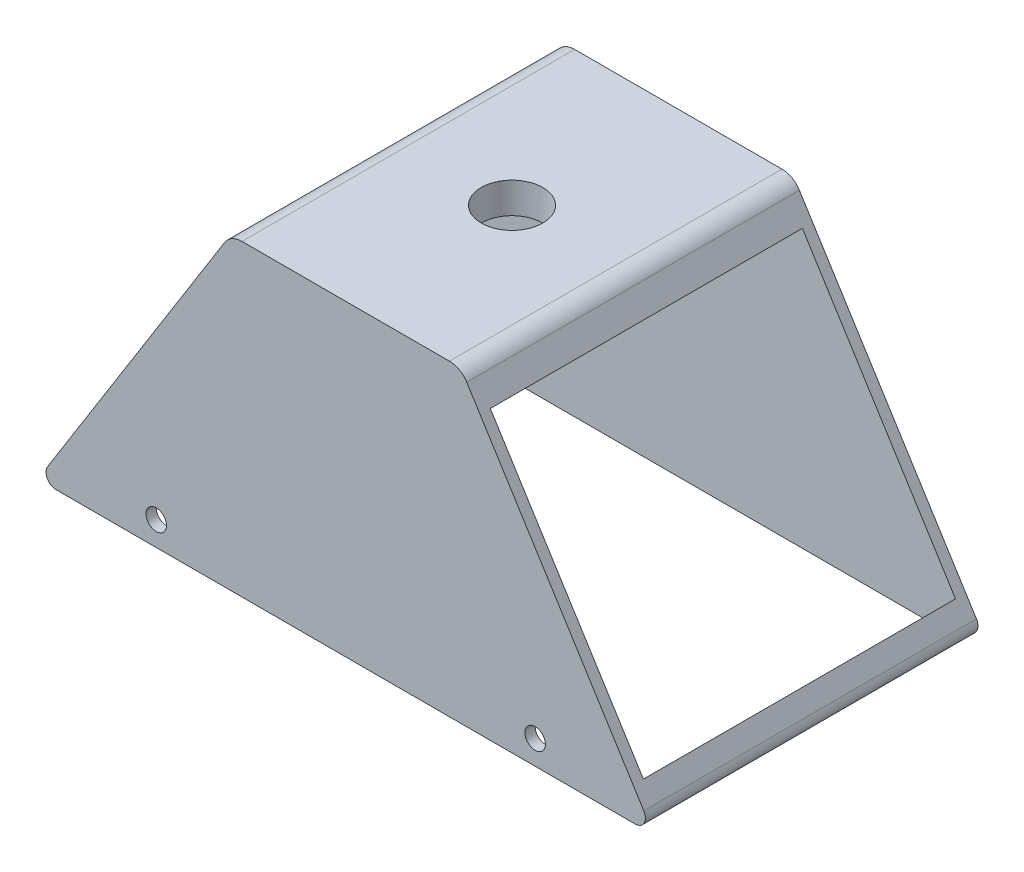
ISO-10303-21;
HEADER;
FILE_DESCRIPTION(('STEP AP214'),'2;1');
FILE_NAME('part.step','',(''),(''),'','','');
FILE_SCHEMA(('AUTOMOTIVE_DESIGN { 1 0 10303 214 1 1 1 1 }'));
ENDSEC;
DATA;
#1=APPLICATION_CONTEXT('core data for automotive mechanical design processes');
#2=APPLICATION_PROTOCOL_DEFINITION('international standard','automotive_design',2000,#1);
#3=PRODUCT_CONTEXT('',#1,'mechanical');
#4=PRODUCT('Part','Part','',(#3));
#5=PRODUCT_RELATED_PRODUCT_CATEGORY('part','',(#4));
#6=PRODUCT_DEFINITION_FORMATION('','',#4);
#7=PRODUCT_DEFINITION_CONTEXT('part definition',#1,'design');
#8=PRODUCT_DEFINITION('design','',#6,#7);
#9=PRODUCT_DEFINITION_SHAPE('','',#8);
#10=(LENGTH_UNIT() NAMED_UNIT(*) SI_UNIT(.MILLI.,.METRE.));
#11=(NAMED_UNIT(*) PLANE_ANGLE_UNIT() SI_UNIT($,.RADIAN.));
#12=(NAMED_UNIT(*) SI_UNIT($,.STERADIAN.) SOLID_ANGLE_UNIT());
#13=UNCERTAINTY_MEASURE_WITH_UNIT(LENGTH_MEASURE(1.E-05),#10,'distance_accuracy_value','');
#14=(GEOMETRIC_REPRESENTATION_CONTEXT(3) GLOBAL_UNCERTAINTY_ASSIGNED_CONTEXT((#13)) GLOBAL_UNIT_ASSIGNED_CONTEXT((#10,
#11,#12)) REPRESENTATION_CONTEXT('',''));
#15=CARTESIAN_POINT('',(0.,0.,0.));
#16=DIRECTION('',(0.,0.,1.));
#17=DIRECTION('',(1.,0.,0.));
#18=AXIS2_PLACEMENT_3D('',#15,#16,#17);
#19=CARTESIAN_POINT('',(-46.0372414198051,83.9135597117547,162.));
#20=DIRECTION('',(0.847457627118644,-0.53086304282596,0.));
#21=DIRECTION('',(0.53086304282596,0.847457627118644,0.));
#22=AXIS2_PLACEMENT_3D('',#19,#20,#21);
#23=PLANE('',#22);
#24=DIRECTION('',(-0.53086304282596,-0.847457627118644,0.));
#25=VECTOR('',#24,1.);
#26=CARTESIAN_POINT('',(-46.0372414198051,83.9135597117547,157.));
#27=LINE('',#26,#25);
#28=CARTESIAN_POINT('',(-55.4335172778245,68.9135597117547,157.));
#29=VERTEX_POINT('',#28);
#30=CARTESIAN_POINT('',(-130.,-50.1226688678928,157.));
#31=VERTEX_POINT('',#30);
#32=EDGE_CURVE('E199',#29,#31,#27,.T.);
#33=ORIENTED_EDGE('',*,*,#32,.T.);
#34=DIRECTION('',(0.,0.,-1.));
#35=VECTOR('',#34,1.);
#36=CARTESIAN_POINT('',(-130.,-50.1226688678928,162.));
#37=LINE('',#36,#35);
#38=CARTESIAN_POINT('',(-130.,-50.1226688678928,5.));
#39=VERTEX_POINT('',#38);
#40=EDGE_CURVE('E202',#31,#39,#37,.T.);
#41=ORIENTED_EDGE('',*,*,#40,.T.);
#42=DIRECTION('',(0.53086304282596,0.847457627118644,0.));
#43=VECTOR('',#42,1.);
#44=CARTESIAN_POINT('',(-46.0372414198051,83.9135597117547,5.));
#45=LINE('',#44,#43);
#46=CARTESIAN_POINT('',(-55.4335172778245,68.9135597117547,5.));
#47=VERTEX_POINT('',#46);
#48=EDGE_CURVE('E196',#39,#47,#45,.T.);
#49=ORIENTED_EDGE('',*,*,#48,.T.);
#50=DIRECTION('',(0.,0.,-1.));
#51=VECTOR('',#50,1.);
#52=CARTESIAN_POINT('',(-55.4335172778245,68.9135597117547,162.));
#53=LINE('',#52,#51);
#54=EDGE_CURVE('E194',#29,#47,#53,.T.);
#55=ORIENTED_EDGE('',*,*,#54,.F.);
#56=EDGE_LOOP('',(#33,#41,#49,#55));
#57=FACE_BOUND('',#56,.T.);
#58=DIRECTION('',(-0.53086304282596,-0.847457627118644,0.));
#59=VECTOR('',#58,1.);
#60=CARTESIAN_POINT('',(-46.0372414198051,83.9135597117547,0.));
#61=LINE('',#60,#59);
#62=CARTESIAN_POINT('',(-48.9760015963378,79.2221901400143,0.));
#63=VERTEX_POINT('',#62);
#64=CARTESIAN_POINT('',(-135.20519618292,-58.4321250741155,0.));
#65=VERTEX_POINT('',#64);
#66=EDGE_CURVE('E208',#63,#65,#61,.T.);
#67=ORIENTED_EDGE('',*,*,#66,.T.);
#68=DIRECTION('',(0.,0.,-1.));
#69=VECTOR('',#68,1.);
#70=CARTESIAN_POINT('',(-135.20519618292,-58.4321250741155,162.));
#71=LINE('',#70,#69);
#72=CARTESIAN_POINT('',(-135.20519618292,-58.4321250741155,162.));
#73=VERTEX_POINT('',#72);
#74=EDGE_CURVE('E13',#65,#73,#71,.F.);
#75=ORIENTED_EDGE('',*,*,#74,.T.);
#76=DIRECTION('',(-0.53086304282596,-0.847457627118644,0.));
#77=VECTOR('',#76,1.);
#78=CARTESIAN_POINT('',(-46.0372414198051,83.9135597117547,162.));
#79=LINE('',#78,#77);
#80=CARTESIAN_POINT('',(-48.9760015963378,79.2221901400143,162.));
#81=VERTEX_POINT('',#80);
#82=EDGE_CURVE('E209',#81,#73,#79,.T.);
#83=ORIENTED_EDGE('',*,*,#82,.F.);
#84=DIRECTION('',(0.,0.,-1.));
#85=VECTOR('',#84,1.);
#86=CARTESIAN_POINT('',(-48.9760015963378,79.2221901400143,162.));
#87=LINE('',#86,#85);
#88=EDGE_CURVE('E232',#81,#63,#87,.T.);
#89=ORIENTED_EDGE('',*,*,#88,.T.);
#90=EDGE_LOOP('',(#67,#75,#83,#89));
#91=FACE_BOUND('',#90,.T.);
#92=ADVANCED_FACE('F47',(#57,#91),#23,.F.);
#93=CARTESIAN_POINT('',(10.,-66.0864402882453,162.));
#94=DIRECTION('',(0.,1.,0.));
#95=DIRECTION('',(0.,0.,1.));
#96=AXIS2_PLACEMENT_3D('',#93,#94,#95);
#97=PLANE('',#96);
#98=DIRECTION('',(1.,0.,0.));
#99=VECTOR('',#98,1.);
#100=CARTESIAN_POINT('',(-130.,-66.0864402882453,5.));
#101=LINE('',#100,#99);
#102=CARTESIAN_POINT('',(-130.,-66.0864402882453,5.));
#103=VERTEX_POINT('',#102);
#104=CARTESIAN_POINT('',(150.,-66.0864402882453,5.));
#105=VERTEX_POINT('',#104);
#106=EDGE_CURVE('E169',#103,#105,#101,.T.);
#107=ORIENTED_EDGE('',*,*,#106,.F.);
#108=DIRECTION('',(0.,0.,-1.));
#109=VECTOR('',#108,1.);
#110=CARTESIAN_POINT('',(-130.,-66.0864402882453,157.));
#111=LINE('',#110,#109);
#112=CARTESIAN_POINT('',(-130.,-66.0864402882453,157.));
#113=VERTEX_POINT('',#112);
#114=EDGE_CURVE('E174',#113,#103,#111,.T.);
#115=ORIENTED_EDGE('',*,*,#114,.F.);
#116=DIRECTION('',(-1.,0.,0.));
#117=VECTOR('',#116,1.);
#118=CARTESIAN_POINT('',(-130.,-66.0864402882453,157.));
#119=LINE('',#118,#117);
#120=CARTESIAN_POINT('',(150.,-66.0864402882453,157.));
#121=VERTEX_POINT('',#120);
#122=EDGE_CURVE('E178',#121,#113,#119,.T.);
#123=ORIENTED_EDGE('',*,*,#122,.F.);
#124=DIRECTION('',(0.,0.,1.));
#125=VECTOR('',#124,1.);
#126=CARTESIAN_POINT('',(150.,-66.0864402882453,157.));
#127=LINE('',#126,#125);
#128=EDGE_CURVE('E157',#105,#121,#127,.T.);
#129=ORIENTED_EDGE('',*,*,#128,.F.);
#130=EDGE_LOOP('',(#107,#115,#123,#129));
#131=FACE_BOUND('',#130,.T.);
#132=DIRECTION('',(1.,0.,0.));
#133=VECTOR('',#132,1.);
#134=CARTESIAN_POINT('',(10.,-66.0864402882453,0.));
#135=LINE('',#134,#133);
#136=CARTESIAN_POINT('',(-130.967908047327,-66.0864402882453,0.));
#137=VERTEX_POINT('',#136);
#138=CARTESIAN_POINT('',(150.967908047327,-66.0864402882453,0.));
#139=VERTEX_POINT('',#138);
#140=EDGE_CURVE('E221',#137,#139,#135,.T.);
#141=ORIENTED_EDGE('',*,*,#140,.T.);
#142=DIRECTION('',(0.,0.,-1.));
#143=VECTOR('',#142,1.);
#144=CARTESIAN_POINT('',(150.967908047327,-66.0864402882453,162.));
#145=LINE('',#144,#143);
#146=CARTESIAN_POINT('',(150.967908047327,-66.0864402882453,162.));
#147=VERTEX_POINT('',#146);
#148=EDGE_CURVE('E70',#139,#147,#145,.F.);
#149=ORIENTED_EDGE('',*,*,#148,.T.);
#150=DIRECTION('',(1.,0.,0.));
#151=VECTOR('',#150,1.);
#152=CARTESIAN_POINT('',(10.,-66.0864402882453,162.));
#153=LINE('',#152,#151);
#154=CARTESIAN_POINT('',(-130.967908047327,-66.0864402882453,162.));
#155=VERTEX_POINT('',#154);
#156=EDGE_CURVE('E211',#155,#147,#153,.T.);
#157=ORIENTED_EDGE('',*,*,#156,.F.);
#158=DIRECTION('',(0.,0.,-1.));
#159=VECTOR('',#158,1.);
#160=CARTESIAN_POINT('',(-130.967908047327,-66.0864402882453,162.));
#161=LINE('',#160,#159);
#162=EDGE_CURVE('E259',#155,#137,#161,.T.);
#163=ORIENTED_EDGE('',*,*,#162,.T.);
#164=EDGE_LOOP('',(#141,#149,#157,#163));
#165=FACE_BOUND('',#164,.T.);
#166=ADVANCED_FACE('F176',(#131,#165),#97,.F.);
#167=CARTESIAN_POINT('',(66.0372414198051,83.9135597117547,162.));
#168=DIRECTION('',(-0.847457627118644,-0.53086304282596,0.));
#169=DIRECTION('',(0.53086304282596,-0.847457627118644,0.));
#170=AXIS2_PLACEMENT_3D('',#167,#168,#169);
#171=PLANE('',#170);
#172=DIRECTION('',(0.,0.,1.));
#173=VECTOR('',#172,1.);
#174=CARTESIAN_POINT('',(150.,-50.1226688678928,162.));
#175=LINE('',#174,#173);
#176=CARTESIAN_POINT('',(150.,-50.1226688678928,5.));
#177=VERTEX_POINT('',#176);
#178=CARTESIAN_POINT('',(150.,-50.1226688678928,157.));
#179=VERTEX_POINT('',#178);
#180=EDGE_CURVE('E160',#177,#179,#175,.T.);
#181=ORIENTED_EDGE('',*,*,#180,.T.);
#182=DIRECTION('',(-0.53086304282596,0.847457627118644,0.));
#183=VECTOR('',#182,1.);
#184=CARTESIAN_POINT('',(66.0372414198051,83.9135597117547,157.));
#185=LINE('',#184,#183);
#186=CARTESIAN_POINT('',(75.4335172778246,68.9135597117547,157.));
#187=VERTEX_POINT('',#186);
#188=EDGE_CURVE('E229',#179,#187,#185,.T.);
#189=ORIENTED_EDGE('',*,*,#188,.T.);
#190=DIRECTION('',(0.,0.,1.));
#191=VECTOR('',#190,1.);
#192=CARTESIAN_POINT('',(75.4335172778246,68.9135597117547,162.));
#193=LINE('',#192,#191);
#194=CARTESIAN_POINT('',(75.4335172778246,68.9135597117547,5.));
#195=VERTEX_POINT('',#194);
#196=EDGE_CURVE('E192',#195,#187,#193,.T.);
#197=ORIENTED_EDGE('',*,*,#196,.F.);
#198=DIRECTION('',(0.53086304282596,-0.847457627118644,0.));
#199=VECTOR('',#198,1.);
#200=CARTESIAN_POINT('',(66.0372414198051,83.9135597117547,5.));
#201=LINE('',#200,#199);
#202=EDGE_CURVE('E219',#195,#177,#201,.T.);
#203=ORIENTED_EDGE('',*,*,#202,.T.);
#204=EDGE_LOOP('',(#181,#189,#197,#203));
#205=FACE_BOUND('',#204,.T.);
#206=DIRECTION('',(-0.53086304282596,0.847457627118644,0.));
#207=VECTOR('',#206,1.);
#208=CARTESIAN_POINT('',(66.0372414198051,83.9135597117547,162.));
#209=LINE('',#208,#207);
#210=CARTESIAN_POINT('',(155.20519618292,-58.4321250741155,162.));
#211=VERTEX_POINT('',#210);
#212=CARTESIAN_POINT('',(68.9760015963379,79.2221901400143,162.));
#213=VERTEX_POINT('',#212);
#214=EDGE_CURVE('E214',#211,#213,#209,.T.);
#215=ORIENTED_EDGE('',*,*,#214,.F.);
#216=DIRECTION('',(0.,0.,-1.));
#217=VECTOR('',#216,1.);
#218=CARTESIAN_POINT('',(155.20519618292,-58.4321250741155,162.));
#219=LINE('',#218,#217);
#220=CARTESIAN_POINT('',(155.20519618292,-58.4321250741155,0.));
#221=VERTEX_POINT('',#220);
#222=EDGE_CURVE('E252',#211,#221,#219,.T.);
#223=ORIENTED_EDGE('',*,*,#222,.T.);
#224=DIRECTION('',(-0.53086304282596,0.847457627118644,0.));
#225=VECTOR('',#224,1.);
#226=CARTESIAN_POINT('',(66.0372414198051,83.9135597117547,0.));
#227=LINE('',#226,#225);
#228=CARTESIAN_POINT('',(68.9760015963379,79.2221901400143,0.));
#229=VERTEX_POINT('',#228);
#230=EDGE_CURVE('E223',#221,#229,#227,.T.);
#231=ORIENTED_EDGE('',*,*,#230,.T.);
#232=DIRECTION('',(0.,0.,-1.));
#233=VECTOR('',#232,1.);
#234=CARTESIAN_POINT('',(68.9760015963379,79.2221901400143,162.));
#235=LINE('',#234,#233);
#236=EDGE_CURVE('E249',#229,#213,#235,.F.);
#237=ORIENTED_EDGE('',*,*,#236,.T.);
#238=EDGE_LOOP('',(#215,#223,#231,#237));
#239=FACE_BOUND('',#238,.T.);
#240=ADVANCED_FACE('F293',(#205,#239),#171,.F.);
#241=CARTESIAN_POINT('',(-46.0372414198051,83.9135597117547,162.));
#242=DIRECTION('',(0.,-1.,0.));
#243=DIRECTION('',(0.,0.,-1.));
#244=AXIS2_PLACEMENT_3D('',#241,#242,#243);
#245=PLANE('',#244);
#246=CARTESIAN_POINT('',(10.,83.9135597117547,81.));
#247=DIRECTION('',(0.,1.,0.));
#248=DIRECTION('',(-1.,0.,0.));
#249=AXIS2_PLACEMENT_3D('',#246,#247,#248);
#250=CIRCLE('',#249,15.);
#251=CARTESIAN_POINT('',(-5.,83.9135597117547,81.));
#252=VERTEX_POINT('',#251);
#253=EDGE_CURVE('E205',#252,#252,#250,.T.);
#254=ORIENTED_EDGE('',*,*,#253,.F.);
#255=EDGE_LOOP('',(#254));
#256=FACE_BOUND('',#255,.T.);
#257=DIRECTION('',(-1.,0.,0.));
#258=VECTOR('',#257,1.);
#259=CARTESIAN_POINT('',(-46.0372414198051,83.9135597117547,0.));
#260=LINE('',#259,#258);
#261=CARTESIAN_POINT('',(60.5014253251514,83.9135597117547,0.));
#262=VERTEX_POINT('',#261);
#263=CARTESIAN_POINT('',(-40.5014253251514,83.9135597117547,0.));
#264=VERTEX_POINT('',#263);
#265=EDGE_CURVE('E212',#262,#264,#260,.T.);
#266=ORIENTED_EDGE('',*,*,#265,.T.);
#267=DIRECTION('',(0.,0.,-1.));
#268=VECTOR('',#267,1.);
#269=CARTESIAN_POINT('',(-40.5014253251514,83.9135597117547,162.));
#270=LINE('',#269,#268);
#271=CARTESIAN_POINT('',(-40.5014253251514,83.9135597117547,162.));
#272=VERTEX_POINT('',#271);
#273=EDGE_CURVE('E243',#264,#272,#270,.F.);
#274=ORIENTED_EDGE('',*,*,#273,.T.);
#275=DIRECTION('',(-1.,0.,0.));
#276=VECTOR('',#275,1.);
#277=CARTESIAN_POINT('',(-46.0372414198051,83.9135597117547,162.));
#278=LINE('',#277,#276);
#279=CARTESIAN_POINT('',(60.5014253251514,83.9135597117547,162.));
#280=VERTEX_POINT('',#279);
#281=EDGE_CURVE('E216',#280,#272,#278,.T.);
#282=ORIENTED_EDGE('',*,*,#281,.F.);
#283=DIRECTION('',(0.,0.,-1.));
#284=VECTOR('',#283,1.);
#285=CARTESIAN_POINT('',(60.5014253251514,83.9135597117547,162.));
#286=LINE('',#285,#284);
#287=EDGE_CURVE('E240',#280,#262,#286,.T.);
#288=ORIENTED_EDGE('',*,*,#287,.T.);
#289=EDGE_LOOP('',(#266,#274,#282,#288));
#290=FACE_BOUND('',#289,.T.);
#291=ADVANCED_FACE('F296',(#256,#290),#245,.F.);
#292=CARTESIAN_POINT('',(0.,0.,162.));
#293=DIRECTION('',(0.,0.,1.));
#294=DIRECTION('',(1.,0.,0.));
#295=AXIS2_PLACEMENT_3D('',#292,#293,#294);
#296=PLANE('',#295);
#297=CARTESIAN_POINT('',(-82.275314,-54.3506202882453,162.));
#298=DIRECTION('',(0.,0.,1.));
#299=DIRECTION('',(-1.,0.,0.));
#300=AXIS2_PLACEMENT_3D('',#297,#298,#299);
#301=CIRCLE('',#300,5.00000000000001);
#302=CARTESIAN_POINT('',(-87.275314,-54.3506202882453,162.));
#303=VERTEX_POINT('',#302);
#304=EDGE_CURVE('E275',#303,#303,#301,.T.);
#305=ORIENTED_EDGE('',*,*,#304,.F.);
#306=EDGE_LOOP('',(#305));
#307=FACE_BOUND('',#306,.T.);
#308=CARTESIAN_POINT('',(102.275314,-54.3506202882453,162.));
#309=DIRECTION('',(0.,0.,1.));
#310=DIRECTION('',(1.,0.,0.));
#311=AXIS2_PLACEMENT_3D('',#308,#309,#310);
#312=CIRCLE('',#311,5.00000000000001);
#313=CARTESIAN_POINT('',(107.275314,-54.3506202882453,162.));
#314=VERTEX_POINT('',#313);
#315=EDGE_CURVE('E267',#314,#314,#312,.T.);
#316=ORIENTED_EDGE('',*,*,#315,.F.);
#317=EDGE_LOOP('',(#316));
#318=FACE_BOUND('',#317,.T.);
#319=ORIENTED_EDGE('',*,*,#156,.T.);
#320=CARTESIAN_POINT('',(150.967908047327,-61.0864402882453,162.));
#321=DIRECTION('',(0.,0.,1.));
#322=DIRECTION('',(1.,0.,0.));
#323=AXIS2_PLACEMENT_3D('',#320,#321,#322);
#324=CIRCLE('',#323,5.);
#325=EDGE_CURVE('E56',#147,#211,#324,.T.);
#326=ORIENTED_EDGE('',*,*,#325,.T.);
#327=ORIENTED_EDGE('',*,*,#214,.T.);
#328=CARTESIAN_POINT('',(60.5014253251514,73.9135597117547,162.));
#329=DIRECTION('',(0.,0.,1.));
#330=DIRECTION('',(1.,0.,0.));
#331=AXIS2_PLACEMENT_3D('',#328,#329,#330);
#332=CIRCLE('',#331,10.);
#333=EDGE_CURVE('E245',#213,#280,#332,.T.);
#334=ORIENTED_EDGE('',*,*,#333,.T.);
#335=ORIENTED_EDGE('',*,*,#281,.T.);
#336=CARTESIAN_POINT('',(-40.5014253251514,73.9135597117547,162.));
#337=DIRECTION('',(0.,0.,1.));
#338=DIRECTION('',(1.,0.,0.));
#339=AXIS2_PLACEMENT_3D('',#336,#337,#338);
#340=CIRCLE('',#339,10.);
#341=EDGE_CURVE('E247',#272,#81,#340,.T.);
#342=ORIENTED_EDGE('',*,*,#341,.T.);
#343=ORIENTED_EDGE('',*,*,#82,.T.);
#344=CARTESIAN_POINT('',(-130.967908047327,-61.0864402882453,162.));
#345=DIRECTION('',(0.,0.,1.));
#346=DIRECTION('',(1.,0.,0.));
#347=AXIS2_PLACEMENT_3D('',#344,#345,#346);
#348=CIRCLE('',#347,5.);
#349=EDGE_CURVE('E263',#73,#155,#348,.T.);
#350=ORIENTED_EDGE('',*,*,#349,.T.);
#351=EDGE_LOOP('',(#319,#326,#327,#334,#335,#342,#343,#350));
#352=FACE_BOUND('',#351,.T.);
#353=ADVANCED_FACE('F325',(#307,#318,#352),#296,.T.);
#354=CARTESIAN_POINT('',(0.,0.,0.));
#355=DIRECTION('',(0.,0.,1.));
#356=DIRECTION('',(1.,0.,0.));
#357=AXIS2_PLACEMENT_3D('',#354,#355,#356);
#358=PLANE('',#357);
#359=ORIENTED_EDGE('',*,*,#230,.F.);
#360=CARTESIAN_POINT('',(150.967908047327,-61.0864402882453,0.));
#361=DIRECTION('',(0.,0.,1.));
#362=DIRECTION('',(1.,0.,0.));
#363=AXIS2_PLACEMENT_3D('',#360,#361,#362);
#364=CIRCLE('',#363,5.);
#365=EDGE_CURVE('E257',#221,#139,#364,.F.);
#366=ORIENTED_EDGE('',*,*,#365,.T.);
#367=ORIENTED_EDGE('',*,*,#140,.F.);
#368=CARTESIAN_POINT('',(-130.967908047327,-61.0864402882453,0.));
#369=DIRECTION('',(0.,0.,1.));
#370=DIRECTION('',(1.,0.,0.));
#371=AXIS2_PLACEMENT_3D('',#368,#369,#370);
#372=CIRCLE('',#371,5.);
#373=EDGE_CURVE('E255',#137,#65,#372,.F.);
#374=ORIENTED_EDGE('',*,*,#373,.T.);
#375=ORIENTED_EDGE('',*,*,#66,.F.);
#376=CARTESIAN_POINT('',(-40.5014253251514,73.9135597117547,0.));
#377=DIRECTION('',(0.,0.,1.));
#378=DIRECTION('',(1.,0.,0.));
#379=AXIS2_PLACEMENT_3D('',#376,#377,#378);
#380=CIRCLE('',#379,10.);
#381=EDGE_CURVE('E238',#63,#264,#380,.F.);
#382=ORIENTED_EDGE('',*,*,#381,.T.);
#383=ORIENTED_EDGE('',*,*,#265,.F.);
#384=CARTESIAN_POINT('',(60.5014253251514,73.9135597117547,0.));
#385=DIRECTION('',(0.,0.,1.));
#386=DIRECTION('',(1.,0.,0.));
#387=AXIS2_PLACEMENT_3D('',#384,#385,#386);
#388=CIRCLE('',#387,10.);
#389=EDGE_CURVE('E235',#262,#229,#388,.F.);
#390=ORIENTED_EDGE('',*,*,#389,.T.);
#391=EDGE_LOOP('',(#359,#366,#367,#374,#375,#382,#383,#390));
#392=FACE_BOUND('',#391,.T.);
#393=ADVANCED_FACE('F309',(#392),#358,.F.);
#394=CARTESIAN_POINT('',(10.,68.9135597117547,81.));
#395=DIRECTION('',(0.,1.,0.));
#396=DIRECTION('',(-1.,0.,0.));
#397=AXIS2_PLACEMENT_3D('',#394,#395,#396);
#398=CYLINDRICAL_SURFACE('',#397,15.);
#399=CARTESIAN_POINT('',(10.,68.9135597117547,81.));
#400=DIRECTION('',(0.,-1.,0.));
#401=DIRECTION('',(0.,0.,-1.));
#402=AXIS2_PLACEMENT_3D('',#399,#400,#401);
#403=CIRCLE('',#402,15.);
#404=CARTESIAN_POINT('',(10.,68.9135597117547,66.));
#405=VERTEX_POINT('',#404);
#406=EDGE_CURVE('E186',#405,#405,#403,.F.);
#407=ORIENTED_EDGE('',*,*,#406,.F.);
#408=EDGE_LOOP('',(#407));
#409=FACE_BOUND('',#408,.T.);
#410=ORIENTED_EDGE('',*,*,#253,.T.);
#411=EDGE_LOOP('',(#410));
#412=FACE_BOUND('',#411,.T.);
#413=ADVANCED_FACE('F333',(#409,#412),#398,.F.);
#414=CARTESIAN_POINT('',(-130.,68.9135597117547,157.));
#415=DIRECTION('',(-1.,0.,0.));
#416=DIRECTION('',(0.,0.,1.));
#417=AXIS2_PLACEMENT_3D('',#414,#415,#416);
#418=PLANE('',#417);
#419=DIRECTION('',(0.,-1.,0.));
#420=VECTOR('',#419,1.);
#421=CARTESIAN_POINT('',(-130.,68.9135597117547,157.));
#422=LINE('',#421,#420);
#423=EDGE_CURVE('E184',#31,#113,#422,.T.);
#424=ORIENTED_EDGE('',*,*,#423,.T.);
#425=ORIENTED_EDGE('',*,*,#114,.T.);
#426=DIRECTION('',(0.,-1.,0.));
#427=VECTOR('',#426,1.);
#428=CARTESIAN_POINT('',(-130.,68.9135597117547,5.));
#429=LINE('',#428,#427);
#430=EDGE_CURVE('E165',#39,#103,#429,.T.);
#431=ORIENTED_EDGE('',*,*,#430,.F.);
#432=ORIENTED_EDGE('',*,*,#40,.F.);
#433=EDGE_LOOP('',(#424,#425,#431,#432));
#434=FACE_BOUND('',#433,.T.);
#435=ADVANCED_FACE('F291',(#434),#418,.F.);
#436=CARTESIAN_POINT('',(-130.,68.9135597117547,157.));
#437=DIRECTION('',(0.,0.,1.));
#438=DIRECTION('',(1.,0.,0.));
#439=AXIS2_PLACEMENT_3D('',#436,#437,#438);
#440=PLANE('',#439);
#441=CARTESIAN_POINT('',(-82.275314,-54.3506202882453,157.));
#442=DIRECTION('',(0.,0.,1.));
#443=DIRECTION('',(1.,0.,0.));
#444=AXIS2_PLACEMENT_3D('',#441,#442,#443);
#445=CIRCLE('',#444,5.00000000000001);
#446=CARTESIAN_POINT('',(-77.275314,-54.3506202882453,157.));
#447=VERTEX_POINT('',#446);
#448=EDGE_CURVE('E51',#447,#447,#445,.T.);
#449=ORIENTED_EDGE('',*,*,#448,.T.);
#450=EDGE_LOOP('',(#449));
#451=FACE_BOUND('',#450,.T.);
#452=CARTESIAN_POINT('',(102.275314,-54.3506202882453,157.));
#453=DIRECTION('',(0.,0.,1.));
#454=DIRECTION('',(1.,0.,0.));
#455=AXIS2_PLACEMENT_3D('',#452,#453,#454);
#456=CIRCLE('',#455,5.00000000000001);
#457=CARTESIAN_POINT('',(107.275314,-54.3506202882453,157.));
#458=VERTEX_POINT('',#457);
#459=EDGE_CURVE('E265',#458,#458,#456,.T.);
#460=ORIENTED_EDGE('',*,*,#459,.T.);
#461=EDGE_LOOP('',(#460));
#462=FACE_BOUND('',#461,.T.);
#463=DIRECTION('',(-1.,0.,0.));
#464=VECTOR('',#463,1.);
#465=CARTESIAN_POINT('',(-130.,68.9135597117547,157.));
#466=LINE('',#465,#464);
#467=EDGE_CURVE('E189',#187,#29,#466,.T.);
#468=ORIENTED_EDGE('',*,*,#467,.F.);
#469=ORIENTED_EDGE('',*,*,#188,.F.);
#470=DIRECTION('',(0.,-1.,0.));
#471=VECTOR('',#470,1.);
#472=CARTESIAN_POINT('',(150.,68.9135597117547,157.));
#473=LINE('',#472,#471);
#474=EDGE_CURVE('E164',#179,#121,#473,.T.);
#475=ORIENTED_EDGE('',*,*,#474,.T.);
#476=ORIENTED_EDGE('',*,*,#122,.T.);
#477=ORIENTED_EDGE('',*,*,#423,.F.);
#478=ORIENTED_EDGE('',*,*,#32,.F.);
#479=EDGE_LOOP('',(#468,#469,#475,#476,#477,#478));
#480=FACE_BOUND('',#479,.T.);
#481=ADVANCED_FACE('F288',(#451,#462,#480),#440,.F.);
#482=CARTESIAN_POINT('',(150.,68.9135597117547,157.));
#483=DIRECTION('',(1.,0.,0.));
#484=DIRECTION('',(0.,0.,-1.));
#485=AXIS2_PLACEMENT_3D('',#482,#483,#484);
#486=PLANE('',#485);
#487=DIRECTION('',(0.,-1.,0.));
#488=VECTOR('',#487,1.);
#489=CARTESIAN_POINT('',(150.,68.9135597117547,5.));
#490=LINE('',#489,#488);
#491=EDGE_CURVE('E152',#177,#105,#490,.T.);
#492=ORIENTED_EDGE('',*,*,#491,.T.);
#493=ORIENTED_EDGE('',*,*,#128,.T.);
#494=ORIENTED_EDGE('',*,*,#474,.F.);
#495=ORIENTED_EDGE('',*,*,#180,.F.);
#496=EDGE_LOOP('',(#492,#493,#494,#495));
#497=FACE_BOUND('',#496,.T.);
#498=ADVANCED_FACE('F154',(#497),#486,.F.);
#499=CARTESIAN_POINT('',(-130.,68.9135597117547,5.));
#500=DIRECTION('',(0.,0.,-1.));
#501=DIRECTION('',(-1.,0.,0.));
#502=AXIS2_PLACEMENT_3D('',#499,#500,#501);
#503=PLANE('',#502);
#504=ORIENTED_EDGE('',*,*,#430,.T.);
#505=ORIENTED_EDGE('',*,*,#106,.T.);
#506=ORIENTED_EDGE('',*,*,#491,.F.);
#507=ORIENTED_EDGE('',*,*,#202,.F.);
#508=DIRECTION('',(1.,0.,0.));
#509=VECTOR('',#508,1.);
#510=CARTESIAN_POINT('',(-130.,68.9135597117547,5.));
#511=LINE('',#510,#509);
#512=EDGE_CURVE('E180',#47,#195,#511,.T.);
#513=ORIENTED_EDGE('',*,*,#512,.F.);
#514=ORIENTED_EDGE('',*,*,#48,.F.);
#515=EDGE_LOOP('',(#504,#505,#506,#507,#513,#514));
#516=FACE_BOUND('',#515,.T.);
#517=ADVANCED_FACE('F170',(#516),#503,.F.);
#518=CARTESIAN_POINT('',(0.,68.9135597117547,0.));
#519=DIRECTION('',(0.,-1.,0.));
#520=DIRECTION('',(0.,0.,-1.));
#521=AXIS2_PLACEMENT_3D('',#518,#519,#520);
#522=PLANE('',#521);
#523=ORIENTED_EDGE('',*,*,#406,.T.);
#524=EDGE_LOOP('',(#523));
#525=FACE_BOUND('',#524,.T.);
#526=ORIENTED_EDGE('',*,*,#54,.T.);
#527=ORIENTED_EDGE('',*,*,#512,.T.);
#528=ORIENTED_EDGE('',*,*,#196,.T.);
#529=ORIENTED_EDGE('',*,*,#467,.T.);
#530=EDGE_LOOP('',(#526,#527,#528,#529));
#531=FACE_BOUND('',#530,.T.);
#532=ADVANCED_FACE('F282',(#525,#531),#522,.T.);
#533=CARTESIAN_POINT('',(-40.5014253251514,73.9135597117547,162.));
#534=DIRECTION('',(0.,0.,-1.));
#535=DIRECTION('',(-1.,0.,0.));
#536=AXIS2_PLACEMENT_3D('',#533,#534,#535);
#537=CYLINDRICAL_SURFACE('',#536,10.);
#538=ORIENTED_EDGE('',*,*,#341,.F.);
#539=ORIENTED_EDGE('',*,*,#273,.F.);
#540=ORIENTED_EDGE('',*,*,#381,.F.);
#541=ORIENTED_EDGE('',*,*,#88,.F.);
#542=EDGE_LOOP('',(#538,#539,#540,#541));
#543=FACE_BOUND('',#542,.T.);
#544=ADVANCED_FACE('F317',(#543),#537,.T.);
#545=CARTESIAN_POINT('',(60.5014253251514,73.9135597117547,162.));
#546=DIRECTION('',(0.,0.,-1.));
#547=DIRECTION('',(-1.,0.,0.));
#548=AXIS2_PLACEMENT_3D('',#545,#546,#547);
#549=CYLINDRICAL_SURFACE('',#548,10.);
#550=ORIENTED_EDGE('',*,*,#333,.F.);
#551=ORIENTED_EDGE('',*,*,#236,.F.);
#552=ORIENTED_EDGE('',*,*,#389,.F.);
#553=ORIENTED_EDGE('',*,*,#287,.F.);
#554=EDGE_LOOP('',(#550,#551,#552,#553));
#555=FACE_BOUND('',#554,.T.);
#556=ADVANCED_FACE('F324',(#555),#549,.T.);
#557=CARTESIAN_POINT('',(150.967908047327,-61.0864402882453,162.));
#558=DIRECTION('',(0.,0.,-1.));
#559=DIRECTION('',(-1.,0.,0.));
#560=AXIS2_PLACEMENT_3D('',#557,#558,#559);
#561=CYLINDRICAL_SURFACE('',#560,5.);
#562=ORIENTED_EDGE('',*,*,#325,.F.);
#563=ORIENTED_EDGE('',*,*,#148,.F.);
#564=ORIENTED_EDGE('',*,*,#365,.F.);
#565=ORIENTED_EDGE('',*,*,#222,.F.);
#566=EDGE_LOOP('',(#562,#563,#564,#565));
#567=FACE_BOUND('',#566,.T.);
#568=ADVANCED_FACE('F306',(#567),#561,.T.);
#569=CARTESIAN_POINT('',(-130.967908047327,-61.0864402882453,162.));
#570=DIRECTION('',(0.,0.,-1.));
#571=DIRECTION('',(-1.,0.,0.));
#572=AXIS2_PLACEMENT_3D('',#569,#570,#571);
#573=CYLINDRICAL_SURFACE('',#572,5.);
#574=ORIENTED_EDGE('',*,*,#349,.F.);
#575=ORIENTED_EDGE('',*,*,#74,.F.);
#576=ORIENTED_EDGE('',*,*,#373,.F.);
#577=ORIENTED_EDGE('',*,*,#162,.F.);
#578=EDGE_LOOP('',(#574,#575,#576,#577));
#579=FACE_BOUND('',#578,.T.);
#580=ADVANCED_FACE('F49',(#579),#573,.T.);
#581=CARTESIAN_POINT('',(102.275314,-54.3506202882453,27.));
#582=DIRECTION('',(0.,0.,1.));
#583=DIRECTION('',(1.,0.,0.));
#584=AXIS2_PLACEMENT_3D('',#581,#582,#583);
#585=CYLINDRICAL_SURFACE('',#584,5.00000000000001);
#586=ORIENTED_EDGE('',*,*,#315,.T.);
#587=EDGE_LOOP('',(#586));
#588=FACE_BOUND('',#587,.T.);
#589=ORIENTED_EDGE('',*,*,#459,.F.);
#590=EDGE_LOOP('',(#589));
#591=FACE_BOUND('',#590,.T.);
#592=ADVANCED_FACE('F354',(#588,#591),#585,.F.);
#593=CARTESIAN_POINT('',(-82.275314,-54.3506202882453,27.));
#594=DIRECTION('',(0.,0.,1.));
#595=DIRECTION('',(1.,0.,0.));
#596=AXIS2_PLACEMENT_3D('',#593,#594,#595);
#597=CYLINDRICAL_SURFACE('',#596,5.00000000000001);
#598=ORIENTED_EDGE('',*,*,#304,.T.);
#599=EDGE_LOOP('',(#598));
#600=FACE_BOUND('',#599,.T.);
#601=ORIENTED_EDGE('',*,*,#448,.F.);
#602=EDGE_LOOP('',(#601));
#603=FACE_BOUND('',#602,.T.);
#604=ADVANCED_FACE('F358',(#600,#603),#597,.F.);
#605=CLOSED_SHELL('',(#92,#166,#240,#291,#353,#393,#413,#435,#481,#498,#517,#532,#544,#556,#568,
#580,#592,#604));
#606=MANIFOLD_SOLID_BREP('B2',#605);
#607=ADVANCED_BREP_SHAPE_REPRESENTATION('',(#18,#606),#14);
#608=SHAPE_DEFINITION_REPRESENTATION(#9,#607);
ENDSEC;
END-ISO-10303-21;
